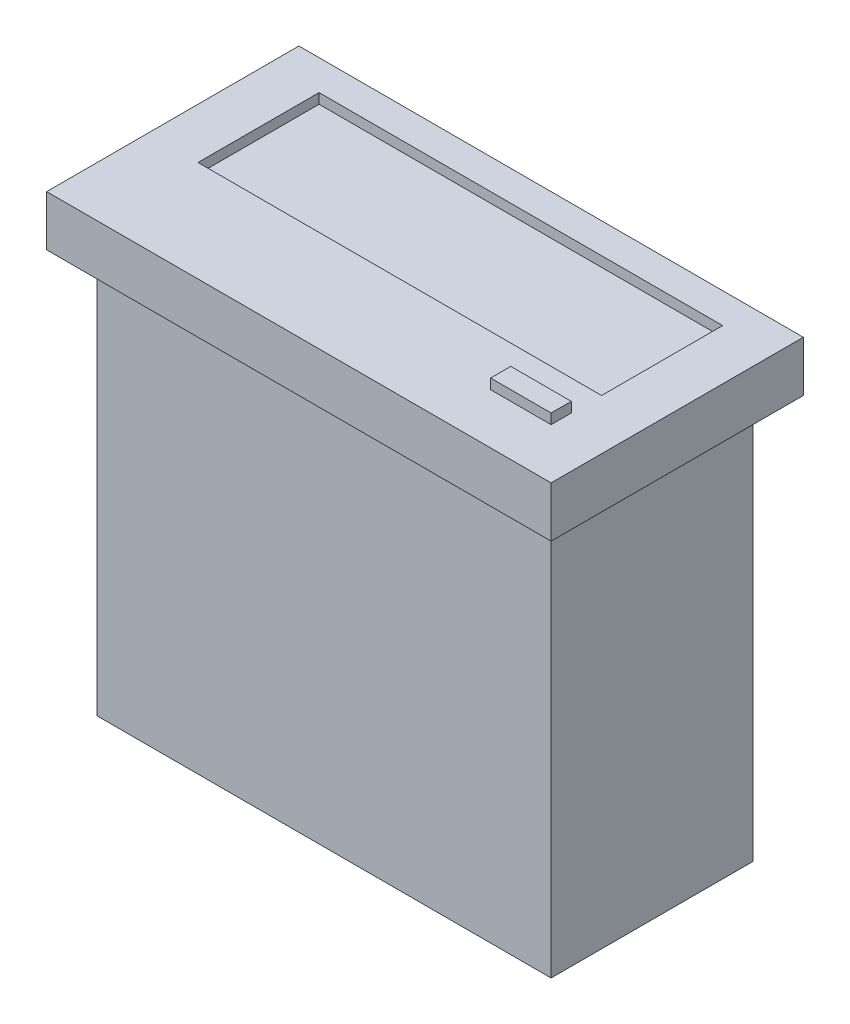
ISO-10303-21;
HEADER;
FILE_DESCRIPTION(('STEP AP214'),'2;1');
FILE_NAME('part.step','',(''),(''),'','','');
FILE_SCHEMA(('AUTOMOTIVE_DESIGN { 1 0 10303 214 1 1 1 1 }'));
ENDSEC;
DATA;
#1=APPLICATION_CONTEXT('core data for automotive mechanical design processes');
#2=APPLICATION_PROTOCOL_DEFINITION('international standard','automotive_design',2000,#1);
#3=PRODUCT_CONTEXT('',#1,'mechanical');
#4=PRODUCT('Part','Part','',(#3));
#5=PRODUCT_RELATED_PRODUCT_CATEGORY('part','',(#4));
#6=PRODUCT_DEFINITION_FORMATION('','',#4);
#7=PRODUCT_DEFINITION_CONTEXT('part definition',#1,'design');
#8=PRODUCT_DEFINITION('design','',#6,#7);
#9=PRODUCT_DEFINITION_SHAPE('','',#8);
#10=(LENGTH_UNIT() NAMED_UNIT(*) SI_UNIT(.MILLI.,.METRE.));
#11=(NAMED_UNIT(*) PLANE_ANGLE_UNIT() SI_UNIT($,.RADIAN.));
#12=(NAMED_UNIT(*) SI_UNIT($,.STERADIAN.) SOLID_ANGLE_UNIT());
#13=UNCERTAINTY_MEASURE_WITH_UNIT(LENGTH_MEASURE(1.E-05),#10,'distance_accuracy_value','');
#14=(GEOMETRIC_REPRESENTATION_CONTEXT(3) GLOBAL_UNCERTAINTY_ASSIGNED_CONTEXT((#13)) GLOBAL_UNIT_ASSIGNED_CONTEXT((#10,
#11,#12)) REPRESENTATION_CONTEXT('',''));
#15=CARTESIAN_POINT('',(0.,0.,0.));
#16=DIRECTION('',(0.,0.,1.));
#17=DIRECTION('',(1.,0.,0.));
#18=AXIS2_PLACEMENT_3D('',#15,#16,#17);
#19=CARTESIAN_POINT('',(0.,0.,0.));
#20=DIRECTION('',(0.,-1.,0.));
#21=DIRECTION('',(0.,0.,-1.));
#22=AXIS2_PLACEMENT_3D('',#19,#20,#21);
#23=PLANE('',#22);
#24=DIRECTION('',(0.,0.,1.));
#25=VECTOR('',#24,1.);
#26=CARTESIAN_POINT('',(0.,0.,0.));
#27=LINE('',#26,#25);
#28=CARTESIAN_POINT('',(0.,0.,-25.));
#29=VERTEX_POINT('',#28);
#30=CARTESIAN_POINT('',(0.,0.,0.));
#31=VERTEX_POINT('',#30);
#32=EDGE_CURVE('E277',#29,#31,#27,.T.);
#33=ORIENTED_EDGE('',*,*,#32,.T.);
#34=DIRECTION('',(1.,0.,0.));
#35=VECTOR('',#34,1.);
#36=CARTESIAN_POINT('',(0.,0.,0.));
#37=LINE('',#36,#35);
#38=CARTESIAN_POINT('',(50.,0.,0.));
#39=VERTEX_POINT('',#38);
#40=EDGE_CURVE('E298',#31,#39,#37,.T.);
#41=ORIENTED_EDGE('',*,*,#40,.T.);
#42=DIRECTION('',(0.,0.,-1.));
#43=VECTOR('',#42,1.);
#44=CARTESIAN_POINT('',(50.,0.,0.));
#45=LINE('',#44,#43);
#46=CARTESIAN_POINT('',(50.,0.,-25.));
#47=VERTEX_POINT('',#46);
#48=EDGE_CURVE('E302',#39,#47,#45,.T.);
#49=ORIENTED_EDGE('',*,*,#48,.T.);
#50=DIRECTION('',(-1.,0.,0.));
#51=VECTOR('',#50,1.);
#52=CARTESIAN_POINT('',(0.,0.,-25.));
#53=LINE('',#52,#51);
#54=EDGE_CURVE('E283',#47,#29,#53,.T.);
#55=ORIENTED_EDGE('',*,*,#54,.T.);
#56=EDGE_LOOP('',(#33,#41,#49,#55));
#57=FACE_BOUND('',#56,.T.);
#58=DIRECTION('',(1.,0.,0.));
#59=VECTOR('',#58,1.);
#60=CARTESIAN_POINT('',(5.,0.,-10.));
#61=LINE('',#60,#59);
#62=CARTESIAN_POINT('',(5.,0.,-10.));
#63=VERTEX_POINT('',#62);
#64=CARTESIAN_POINT('',(45.,0.,-10.));
#65=VERTEX_POINT('',#64);
#66=EDGE_CURVE('E186',#63,#65,#61,.T.);
#67=ORIENTED_EDGE('',*,*,#66,.F.);
#68=DIRECTION('',(0.,0.,1.));
#69=VECTOR('',#68,1.);
#70=CARTESIAN_POINT('',(5.,0.,-10.));
#71=LINE('',#70,#69);
#72=CARTESIAN_POINT('',(5.,0.,-22.));
#73=VERTEX_POINT('',#72);
#74=EDGE_CURVE('E180',#73,#63,#71,.T.);
#75=ORIENTED_EDGE('',*,*,#74,.F.);
#76=DIRECTION('',(-1.,0.,0.));
#77=VECTOR('',#76,1.);
#78=CARTESIAN_POINT('',(5.,0.,-22.));
#79=LINE('',#78,#77);
#80=CARTESIAN_POINT('',(45.,0.,-22.));
#81=VERTEX_POINT('',#80);
#82=EDGE_CURVE('E197',#81,#73,#79,.T.);
#83=ORIENTED_EDGE('',*,*,#82,.F.);
#84=DIRECTION('',(0.,0.,-1.));
#85=VECTOR('',#84,1.);
#86=CARTESIAN_POINT('',(45.,0.,-10.));
#87=LINE('',#86,#85);
#88=EDGE_CURVE('E213',#65,#81,#87,.T.);
#89=ORIENTED_EDGE('',*,*,#88,.F.);
#90=EDGE_LOOP('',(#67,#75,#83,#89));
#91=FACE_BOUND('',#90,.T.);
#92=DIRECTION('',(0.,0.,1.));
#93=VECTOR('',#92,1.);
#94=CARTESIAN_POINT('',(39.,0.,-7.));
#95=LINE('',#94,#93);
#96=CARTESIAN_POINT('',(39.,0.,-7.));
#97=VERTEX_POINT('',#96);
#98=CARTESIAN_POINT('',(39.,0.,-5.));
#99=VERTEX_POINT('',#98);
#100=EDGE_CURVE('E178',#97,#99,#95,.T.);
#101=ORIENTED_EDGE('',*,*,#100,.F.);
#102=DIRECTION('',(-1.,0.,0.));
#103=VECTOR('',#102,1.);
#104=CARTESIAN_POINT('',(39.,0.,-7.));
#105=LINE('',#104,#103);
#106=CARTESIAN_POINT('',(45.,0.,-7.));
#107=VERTEX_POINT('',#106);
#108=EDGE_CURVE('E175',#107,#97,#105,.T.);
#109=ORIENTED_EDGE('',*,*,#108,.F.);
#110=DIRECTION('',(0.,0.,-1.));
#111=VECTOR('',#110,1.);
#112=CARTESIAN_POINT('',(45.,0.,-7.));
#113=LINE('',#112,#111);
#114=CARTESIAN_POINT('',(45.,0.,-5.));
#115=VERTEX_POINT('',#114);
#116=EDGE_CURVE('E64',#115,#107,#113,.T.);
#117=ORIENTED_EDGE('',*,*,#116,.F.);
#118=DIRECTION('',(1.,0.,0.));
#119=VECTOR('',#118,1.);
#120=CARTESIAN_POINT('',(39.,0.,-5.));
#121=LINE('',#120,#119);
#122=EDGE_CURVE('E59',#99,#115,#121,.T.);
#123=ORIENTED_EDGE('',*,*,#122,.F.);
#124=EDGE_LOOP('',(#101,#109,#117,#123));
#125=FACE_BOUND('',#124,.T.);
#126=ADVANCED_FACE('F41',(#57,#91,#125),#23,.F.);
#127=CARTESIAN_POINT('',(0.,-5.,0.));
#128=DIRECTION('',(-1.,0.,0.));
#129=DIRECTION('',(0.,0.,1.));
#130=AXIS2_PLACEMENT_3D('',#127,#128,#129);
#131=PLANE('',#130);
#132=ORIENTED_EDGE('',*,*,#32,.F.);
#133=DIRECTION('',(0.,1.,0.));
#134=VECTOR('',#133,1.);
#135=CARTESIAN_POINT('',(0.,-5.,-25.));
#136=LINE('',#135,#134);
#137=CARTESIAN_POINT('',(0.,-5.,-25.));
#138=VERTEX_POINT('',#137);
#139=EDGE_CURVE('E11',#138,#29,#136,.T.);
#140=ORIENTED_EDGE('',*,*,#139,.F.);
#141=DIRECTION('',(0.,0.,1.));
#142=VECTOR('',#141,1.);
#143=CARTESIAN_POINT('',(0.,-5.,0.));
#144=LINE('',#143,#142);
#145=CARTESIAN_POINT('',(0.,-5.,0.));
#146=VERTEX_POINT('',#145);
#147=EDGE_CURVE('E278',#138,#146,#144,.T.);
#148=ORIENTED_EDGE('',*,*,#147,.T.);
#149=DIRECTION('',(0.,1.,0.));
#150=VECTOR('',#149,1.);
#151=CARTESIAN_POINT('',(0.,-5.,0.));
#152=LINE('',#151,#150);
#153=EDGE_CURVE('E45',#146,#31,#152,.T.);
#154=ORIENTED_EDGE('',*,*,#153,.T.);
#155=EDGE_LOOP('',(#132,#140,#148,#154));
#156=FACE_BOUND('',#155,.T.);
#157=ADVANCED_FACE('F43',(#156),#131,.T.);
#158=CARTESIAN_POINT('',(0.,-5.,-25.));
#159=DIRECTION('',(0.,0.,-1.));
#160=DIRECTION('',(-1.,0.,0.));
#161=AXIS2_PLACEMENT_3D('',#158,#159,#160);
#162=PLANE('',#161);
#163=ORIENTED_EDGE('',*,*,#54,.F.);
#164=DIRECTION('',(0.,1.,0.));
#165=VECTOR('',#164,1.);
#166=CARTESIAN_POINT('',(50.,-5.,-25.));
#167=LINE('',#166,#165);
#168=CARTESIAN_POINT('',(50.,-5.,-25.));
#169=VERTEX_POINT('',#168);
#170=EDGE_CURVE('E51',#169,#47,#167,.T.);
#171=ORIENTED_EDGE('',*,*,#170,.F.);
#172=DIRECTION('',(-1.,0.,0.));
#173=VECTOR('',#172,1.);
#174=CARTESIAN_POINT('',(0.,-5.,-25.));
#175=LINE('',#174,#173);
#176=EDGE_CURVE('E291',#169,#138,#175,.T.);
#177=ORIENTED_EDGE('',*,*,#176,.T.);
#178=ORIENTED_EDGE('',*,*,#139,.T.);
#179=EDGE_LOOP('',(#163,#171,#177,#178));
#180=FACE_BOUND('',#179,.T.);
#181=ADVANCED_FACE('F329',(#180),#162,.T.);
#182=CARTESIAN_POINT('',(50.,-5.,0.));
#183=DIRECTION('',(1.,0.,0.));
#184=DIRECTION('',(0.,0.,-1.));
#185=AXIS2_PLACEMENT_3D('',#182,#183,#184);
#186=PLANE('',#185);
#187=ORIENTED_EDGE('',*,*,#48,.F.);
#188=DIRECTION('',(0.,1.,0.));
#189=VECTOR('',#188,1.);
#190=CARTESIAN_POINT('',(50.,-5.,0.));
#191=LINE('',#190,#189);
#192=CARTESIAN_POINT('',(50.,-5.,0.));
#193=VERTEX_POINT('',#192);
#194=EDGE_CURVE('E310',#193,#39,#191,.T.);
#195=ORIENTED_EDGE('',*,*,#194,.F.);
#196=DIRECTION('',(0.,0.,-1.));
#197=VECTOR('',#196,1.);
#198=CARTESIAN_POINT('',(50.,-5.,0.));
#199=LINE('',#198,#197);
#200=EDGE_CURVE('E287',#193,#169,#199,.T.);
#201=ORIENTED_EDGE('',*,*,#200,.T.);
#202=ORIENTED_EDGE('',*,*,#170,.T.);
#203=EDGE_LOOP('',(#187,#195,#201,#202));
#204=FACE_BOUND('',#203,.T.);
#205=ADVANCED_FACE('F335',(#204),#186,.T.);
#206=CARTESIAN_POINT('',(0.,-5.,0.));
#207=DIRECTION('',(0.,0.,1.));
#208=DIRECTION('',(1.,0.,0.));
#209=AXIS2_PLACEMENT_3D('',#206,#207,#208);
#210=PLANE('',#209);
#211=ORIENTED_EDGE('',*,*,#40,.F.);
#212=ORIENTED_EDGE('',*,*,#153,.F.);
#213=DIRECTION('',(1.,0.,0.));
#214=VECTOR('',#213,1.);
#215=CARTESIAN_POINT('',(0.,-5.,0.));
#216=LINE('',#215,#214);
#217=EDGE_CURVE('E282',#146,#193,#216,.T.);
#218=ORIENTED_EDGE('',*,*,#217,.T.);
#219=ORIENTED_EDGE('',*,*,#194,.T.);
#220=EDGE_LOOP('',(#211,#212,#218,#219));
#221=FACE_BOUND('',#220,.T.);
#222=ADVANCED_FACE('F324',(#221),#210,.T.);
#223=CARTESIAN_POINT('',(0.,-5.,0.));
#224=DIRECTION('',(0.,-1.,0.));
#225=DIRECTION('',(0.,0.,-1.));
#226=AXIS2_PLACEMENT_3D('',#223,#224,#225);
#227=PLANE('',#226);
#228=DIRECTION('',(0.,0.,-1.));
#229=VECTOR('',#228,1.);
#230=CARTESIAN_POINT('',(2.5,-5.,-2.5));
#231=LINE('',#230,#229);
#232=CARTESIAN_POINT('',(2.5,-5.,-2.5));
#233=VERTEX_POINT('',#232);
#234=CARTESIAN_POINT('',(2.49999999999999,-5.,-22.5));
#235=VERTEX_POINT('',#234);
#236=EDGE_CURVE('E223',#233,#235,#231,.T.);
#237=ORIENTED_EDGE('',*,*,#236,.F.);
#238=DIRECTION('',(-1.,0.,0.));
#239=VECTOR('',#238,1.);
#240=CARTESIAN_POINT('',(2.5,-5.,-2.5));
#241=LINE('',#240,#239);
#242=CARTESIAN_POINT('',(47.5,-5.,-2.49999999999999));
#243=VERTEX_POINT('',#242);
#244=EDGE_CURVE('E238',#243,#233,#241,.T.);
#245=ORIENTED_EDGE('',*,*,#244,.F.);
#246=DIRECTION('',(0.,0.,1.));
#247=VECTOR('',#246,1.);
#248=CARTESIAN_POINT('',(47.5,-5.,-2.49999999999999));
#249=LINE('',#248,#247);
#250=CARTESIAN_POINT('',(47.5,-5.,-22.5));
#251=VERTEX_POINT('',#250);
#252=EDGE_CURVE('E255',#251,#243,#249,.T.);
#253=ORIENTED_EDGE('',*,*,#252,.F.);
#254=DIRECTION('',(1.,0.,0.));
#255=VECTOR('',#254,1.);
#256=CARTESIAN_POINT('',(2.49999999999999,-5.,-22.5));
#257=LINE('',#256,#255);
#258=EDGE_CURVE('E251',#235,#251,#257,.T.);
#259=ORIENTED_EDGE('',*,*,#258,.F.);
#260=EDGE_LOOP('',(#237,#245,#253,#259));
#261=FACE_BOUND('',#260,.T.);
#262=ORIENTED_EDGE('',*,*,#147,.F.);
#263=ORIENTED_EDGE('',*,*,#176,.F.);
#264=ORIENTED_EDGE('',*,*,#200,.F.);
#265=ORIENTED_EDGE('',*,*,#217,.F.);
#266=EDGE_LOOP('',(#262,#263,#264,#265));
#267=FACE_BOUND('',#266,.T.);
#268=ADVANCED_FACE('F332',(#261,#267),#227,.T.);
#269=CARTESIAN_POINT('',(2.5,-45.,-2.5));
#270=DIRECTION('',(1.,0.,0.));
#271=DIRECTION('',(0.,0.,-1.));
#272=AXIS2_PLACEMENT_3D('',#269,#270,#271);
#273=PLANE('',#272);
#274=ORIENTED_EDGE('',*,*,#236,.T.);
#275=DIRECTION('',(0.,1.,0.));
#276=VECTOR('',#275,1.);
#277=CARTESIAN_POINT('',(2.49999999999999,-45.,-22.5));
#278=LINE('',#277,#276);
#279=CARTESIAN_POINT('',(2.49999999999999,-45.,-22.5));
#280=VERTEX_POINT('',#279);
#281=EDGE_CURVE('E273',#280,#235,#278,.T.);
#282=ORIENTED_EDGE('',*,*,#281,.F.);
#283=DIRECTION('',(0.,0.,-1.));
#284=VECTOR('',#283,1.);
#285=CARTESIAN_POINT('',(2.5,-45.,-2.5));
#286=LINE('',#285,#284);
#287=CARTESIAN_POINT('',(2.5,-45.,-2.5));
#288=VERTEX_POINT('',#287);
#289=EDGE_CURVE('E233',#288,#280,#286,.T.);
#290=ORIENTED_EDGE('',*,*,#289,.F.);
#291=DIRECTION('',(0.,1.,0.));
#292=VECTOR('',#291,1.);
#293=CARTESIAN_POINT('',(2.5,-45.,-2.5));
#294=LINE('',#293,#292);
#295=EDGE_CURVE('E247',#288,#233,#294,.T.);
#296=ORIENTED_EDGE('',*,*,#295,.T.);
#297=EDGE_LOOP('',(#274,#282,#290,#296));
#298=FACE_BOUND('',#297,.T.);
#299=ADVANCED_FACE('F351',(#298),#273,.F.);
#300=CARTESIAN_POINT('',(2.49999999999999,-45.,-22.5));
#301=DIRECTION('',(0.,0.,1.));
#302=DIRECTION('',(1.,0.,0.));
#303=AXIS2_PLACEMENT_3D('',#300,#301,#302);
#304=PLANE('',#303);
#305=ORIENTED_EDGE('',*,*,#258,.T.);
#306=DIRECTION('',(0.,1.,0.));
#307=VECTOR('',#306,1.);
#308=CARTESIAN_POINT('',(47.5,-45.,-22.5));
#309=LINE('',#308,#307);
#310=CARTESIAN_POINT('',(47.5,-45.,-22.5));
#311=VERTEX_POINT('',#310);
#312=EDGE_CURVE('E269',#311,#251,#309,.T.);
#313=ORIENTED_EDGE('',*,*,#312,.F.);
#314=DIRECTION('',(1.,0.,0.));
#315=VECTOR('',#314,1.);
#316=CARTESIAN_POINT('',(2.49999999999999,-45.,-22.5));
#317=LINE('',#316,#315);
#318=EDGE_CURVE('E237',#280,#311,#317,.T.);
#319=ORIENTED_EDGE('',*,*,#318,.F.);
#320=ORIENTED_EDGE('',*,*,#281,.T.);
#321=EDGE_LOOP('',(#305,#313,#319,#320));
#322=FACE_BOUND('',#321,.T.);
#323=ADVANCED_FACE('F355',(#322),#304,.F.);
#324=CARTESIAN_POINT('',(47.5,-45.,-2.49999999999999));
#325=DIRECTION('',(-1.,0.,0.));
#326=DIRECTION('',(0.,0.,1.));
#327=AXIS2_PLACEMENT_3D('',#324,#325,#326);
#328=PLANE('',#327);
#329=ORIENTED_EDGE('',*,*,#252,.T.);
#330=DIRECTION('',(0.,1.,0.));
#331=VECTOR('',#330,1.);
#332=CARTESIAN_POINT('',(47.5,-45.,-2.49999999999999));
#333=LINE('',#332,#331);
#334=CARTESIAN_POINT('',(47.5,-45.,-2.49999999999999));
#335=VERTEX_POINT('',#334);
#336=EDGE_CURVE('E265',#335,#243,#333,.T.);
#337=ORIENTED_EDGE('',*,*,#336,.F.);
#338=DIRECTION('',(0.,0.,1.));
#339=VECTOR('',#338,1.);
#340=CARTESIAN_POINT('',(47.5,-45.,-2.49999999999999));
#341=LINE('',#340,#339);
#342=EDGE_CURVE('E241',#311,#335,#341,.T.);
#343=ORIENTED_EDGE('',*,*,#342,.F.);
#344=ORIENTED_EDGE('',*,*,#312,.T.);
#345=EDGE_LOOP('',(#329,#337,#343,#344));
#346=FACE_BOUND('',#345,.T.);
#347=ADVANCED_FACE('F359',(#346),#328,.F.);
#348=CARTESIAN_POINT('',(2.5,-45.,-2.5));
#349=DIRECTION('',(0.,0.,-1.));
#350=DIRECTION('',(-1.,0.,0.));
#351=AXIS2_PLACEMENT_3D('',#348,#349,#350);
#352=PLANE('',#351);
#353=ORIENTED_EDGE('',*,*,#244,.T.);
#354=ORIENTED_EDGE('',*,*,#295,.F.);
#355=DIRECTION('',(-1.,0.,0.));
#356=VECTOR('',#355,1.);
#357=CARTESIAN_POINT('',(2.5,-45.,-2.5));
#358=LINE('',#357,#356);
#359=EDGE_CURVE('E244',#335,#288,#358,.T.);
#360=ORIENTED_EDGE('',*,*,#359,.F.);
#361=ORIENTED_EDGE('',*,*,#336,.T.);
#362=EDGE_LOOP('',(#353,#354,#360,#361));
#363=FACE_BOUND('',#362,.T.);
#364=ADVANCED_FACE('F363',(#363),#352,.F.);
#365=CARTESIAN_POINT('',(0.,-45.,0.));
#366=DIRECTION('',(0.,-1.,0.));
#367=DIRECTION('',(0.,0.,-1.));
#368=AXIS2_PLACEMENT_3D('',#365,#366,#367);
#369=PLANE('',#368);
#370=ORIENTED_EDGE('',*,*,#289,.T.);
#371=ORIENTED_EDGE('',*,*,#318,.T.);
#372=ORIENTED_EDGE('',*,*,#342,.T.);
#373=ORIENTED_EDGE('',*,*,#359,.T.);
#374=EDGE_LOOP('',(#370,#371,#372,#373));
#375=FACE_BOUND('',#374,.T.);
#376=ADVANCED_FACE('F367',(#375),#369,.T.);
#377=CARTESIAN_POINT('',(5.,-1.,-10.));
#378=DIRECTION('',(-1.,0.,0.));
#379=DIRECTION('',(0.,0.,1.));
#380=AXIS2_PLACEMENT_3D('',#377,#378,#379);
#381=PLANE('',#380);
#382=ORIENTED_EDGE('',*,*,#74,.T.);
#383=DIRECTION('',(0.,1.,0.));
#384=VECTOR('',#383,1.);
#385=CARTESIAN_POINT('',(5.,-1.,-10.));
#386=LINE('',#385,#384);
#387=CARTESIAN_POINT('',(5.,-1.,-10.));
#388=VERTEX_POINT('',#387);
#389=EDGE_CURVE('E208',#388,#63,#386,.T.);
#390=ORIENTED_EDGE('',*,*,#389,.F.);
#391=DIRECTION('',(0.,0.,1.));
#392=VECTOR('',#391,1.);
#393=CARTESIAN_POINT('',(5.,-1.,-10.));
#394=LINE('',#393,#392);
#395=CARTESIAN_POINT('',(5.,-1.,-22.));
#396=VERTEX_POINT('',#395);
#397=EDGE_CURVE('E192',#396,#388,#394,.T.);
#398=ORIENTED_EDGE('',*,*,#397,.F.);
#399=DIRECTION('',(0.,1.,0.));
#400=VECTOR('',#399,1.);
#401=CARTESIAN_POINT('',(5.,-1.,-22.));
#402=LINE('',#401,#400);
#403=EDGE_CURVE('E220',#396,#73,#402,.T.);
#404=ORIENTED_EDGE('',*,*,#403,.T.);
#405=EDGE_LOOP('',(#382,#390,#398,#404));
#406=FACE_BOUND('',#405,.T.);
#407=ADVANCED_FACE('F371',(#406),#381,.F.);
#408=CARTESIAN_POINT('',(5.,-1.,-22.));
#409=DIRECTION('',(0.,0.,-1.));
#410=DIRECTION('',(-1.,0.,0.));
#411=AXIS2_PLACEMENT_3D('',#408,#409,#410);
#412=PLANE('',#411);
#413=ORIENTED_EDGE('',*,*,#82,.T.);
#414=ORIENTED_EDGE('',*,*,#403,.F.);
#415=DIRECTION('',(-1.,0.,0.));
#416=VECTOR('',#415,1.);
#417=CARTESIAN_POINT('',(5.,-1.,-22.));
#418=LINE('',#417,#416);
#419=CARTESIAN_POINT('',(45.,-1.,-22.));
#420=VERTEX_POINT('',#419);
#421=EDGE_CURVE('E205',#420,#396,#418,.T.);
#422=ORIENTED_EDGE('',*,*,#421,.F.);
#423=DIRECTION('',(0.,1.,0.));
#424=VECTOR('',#423,1.);
#425=CARTESIAN_POINT('',(45.,-1.,-22.));
#426=LINE('',#425,#424);
#427=EDGE_CURVE('E224',#420,#81,#426,.T.);
#428=ORIENTED_EDGE('',*,*,#427,.T.);
#429=EDGE_LOOP('',(#413,#414,#422,#428));
#430=FACE_BOUND('',#429,.T.);
#431=ADVANCED_FACE('F375',(#430),#412,.F.);
#432=CARTESIAN_POINT('',(45.,-1.,-10.));
#433=DIRECTION('',(1.,0.,0.));
#434=DIRECTION('',(0.,0.,-1.));
#435=AXIS2_PLACEMENT_3D('',#432,#433,#434);
#436=PLANE('',#435);
#437=ORIENTED_EDGE('',*,*,#88,.T.);
#438=ORIENTED_EDGE('',*,*,#427,.F.);
#439=DIRECTION('',(0.,0.,-1.));
#440=VECTOR('',#439,1.);
#441=CARTESIAN_POINT('',(45.,-1.,-10.));
#442=LINE('',#441,#440);
#443=CARTESIAN_POINT('',(45.,-1.,-10.));
#444=VERTEX_POINT('',#443);
#445=EDGE_CURVE('E201',#444,#420,#442,.T.);
#446=ORIENTED_EDGE('',*,*,#445,.F.);
#447=DIRECTION('',(0.,1.,0.));
#448=VECTOR('',#447,1.);
#449=CARTESIAN_POINT('',(45.,-1.,-10.));
#450=LINE('',#449,#448);
#451=EDGE_CURVE('E227',#444,#65,#450,.T.);
#452=ORIENTED_EDGE('',*,*,#451,.T.);
#453=EDGE_LOOP('',(#437,#438,#446,#452));
#454=FACE_BOUND('',#453,.T.);
#455=ADVANCED_FACE('F381',(#454),#436,.F.);
#456=CARTESIAN_POINT('',(5.,-1.,-10.));
#457=DIRECTION('',(0.,0.,1.));
#458=DIRECTION('',(1.,0.,0.));
#459=AXIS2_PLACEMENT_3D('',#456,#457,#458);
#460=PLANE('',#459);
#461=ORIENTED_EDGE('',*,*,#66,.T.);
#462=ORIENTED_EDGE('',*,*,#451,.F.);
#463=DIRECTION('',(1.,0.,0.));
#464=VECTOR('',#463,1.);
#465=CARTESIAN_POINT('',(5.,-1.,-10.));
#466=LINE('',#465,#464);
#467=EDGE_CURVE('E196',#388,#444,#466,.T.);
#468=ORIENTED_EDGE('',*,*,#467,.F.);
#469=ORIENTED_EDGE('',*,*,#389,.T.);
#470=EDGE_LOOP('',(#461,#462,#468,#469));
#471=FACE_BOUND('',#470,.T.);
#472=ADVANCED_FACE('F377',(#471),#460,.F.);
#473=CARTESIAN_POINT('',(0.,-1.,0.));
#474=DIRECTION('',(0.,-1.,0.));
#475=DIRECTION('',(0.,0.,-1.));
#476=AXIS2_PLACEMENT_3D('',#473,#474,#475);
#477=PLANE('',#476);
#478=ORIENTED_EDGE('',*,*,#397,.T.);
#479=ORIENTED_EDGE('',*,*,#467,.T.);
#480=ORIENTED_EDGE('',*,*,#445,.T.);
#481=ORIENTED_EDGE('',*,*,#421,.T.);
#482=EDGE_LOOP('',(#478,#479,#480,#481));
#483=FACE_BOUND('',#482,.T.);
#484=ADVANCED_FACE('F380',(#483),#477,.F.);
#485=CARTESIAN_POINT('',(39.,1.,-7.));
#486=DIRECTION('',(1.,0.,0.));
#487=DIRECTION('',(0.,0.,-1.));
#488=AXIS2_PLACEMENT_3D('',#485,#486,#487);
#489=PLANE('',#488);
#490=ORIENTED_EDGE('',*,*,#100,.T.);
#491=DIRECTION('',(0.,-1.,0.));
#492=VECTOR('',#491,1.);
#493=CARTESIAN_POINT('',(39.,1.,-5.));
#494=LINE('',#493,#492);
#495=CARTESIAN_POINT('',(39.,1.,-5.));
#496=VERTEX_POINT('',#495);
#497=EDGE_CURVE('E157',#496,#99,#494,.T.);
#498=ORIENTED_EDGE('',*,*,#497,.F.);
#499=DIRECTION('',(0.,0.,1.));
#500=VECTOR('',#499,1.);
#501=CARTESIAN_POINT('',(39.,1.,-7.));
#502=LINE('',#501,#500);
#503=CARTESIAN_POINT('',(39.,1.,-7.));
#504=VERTEX_POINT('',#503);
#505=EDGE_CURVE('E165',#504,#496,#502,.T.);
#506=ORIENTED_EDGE('',*,*,#505,.F.);
#507=DIRECTION('',(0.,-1.,0.));
#508=VECTOR('',#507,1.);
#509=CARTESIAN_POINT('',(39.,1.,-7.));
#510=LINE('',#509,#508);
#511=EDGE_CURVE('E592',#504,#97,#510,.T.);
#512=ORIENTED_EDGE('',*,*,#511,.T.);
#513=EDGE_LOOP('',(#490,#498,#506,#512));
#514=FACE_BOUND('',#513,.T.);
#515=ADVANCED_FACE('F177',(#514),#489,.F.);
#516=CARTESIAN_POINT('',(39.,1.,-5.));
#517=DIRECTION('',(0.,0.,-1.));
#518=DIRECTION('',(-1.,0.,0.));
#519=AXIS2_PLACEMENT_3D('',#516,#517,#518);
#520=PLANE('',#519);
#521=ORIENTED_EDGE('',*,*,#122,.T.);
#522=DIRECTION('',(0.,-1.,0.));
#523=VECTOR('',#522,1.);
#524=CARTESIAN_POINT('',(45.,1.,-5.));
#525=LINE('',#524,#523);
#526=CARTESIAN_POINT('',(45.,1.,-5.));
#527=VERTEX_POINT('',#526);
#528=EDGE_CURVE('E160',#527,#115,#525,.T.);
#529=ORIENTED_EDGE('',*,*,#528,.F.);
#530=DIRECTION('',(1.,0.,0.));
#531=VECTOR('',#530,1.);
#532=CARTESIAN_POINT('',(39.,1.,-5.));
#533=LINE('',#532,#531);
#534=EDGE_CURVE('E153',#496,#527,#533,.T.);
#535=ORIENTED_EDGE('',*,*,#534,.F.);
#536=ORIENTED_EDGE('',*,*,#497,.T.);
#537=EDGE_LOOP('',(#521,#529,#535,#536));
#538=FACE_BOUND('',#537,.T.);
#539=ADVANCED_FACE('F155',(#538),#520,.F.);
#540=CARTESIAN_POINT('',(45.,1.,-7.));
#541=DIRECTION('',(-1.,0.,0.));
#542=DIRECTION('',(0.,0.,1.));
#543=AXIS2_PLACEMENT_3D('',#540,#541,#542);
#544=PLANE('',#543);
#545=ORIENTED_EDGE('',*,*,#116,.T.);
#546=DIRECTION('',(0.,-1.,0.));
#547=VECTOR('',#546,1.);
#548=CARTESIAN_POINT('',(45.,1.,-7.));
#549=LINE('',#548,#547);
#550=CARTESIAN_POINT('',(45.,1.,-7.));
#551=VERTEX_POINT('',#550);
#552=EDGE_CURVE('E188',#551,#107,#549,.T.);
#553=ORIENTED_EDGE('',*,*,#552,.F.);
#554=DIRECTION('',(0.,0.,-1.));
#555=VECTOR('',#554,1.);
#556=CARTESIAN_POINT('',(45.,1.,-7.));
#557=LINE('',#556,#555);
#558=EDGE_CURVE('E164',#527,#551,#557,.T.);
#559=ORIENTED_EDGE('',*,*,#558,.F.);
#560=ORIENTED_EDGE('',*,*,#528,.T.);
#561=EDGE_LOOP('',(#545,#553,#559,#560));
#562=FACE_BOUND('',#561,.T.);
#563=ADVANCED_FACE('F396',(#562),#544,.F.);
#564=CARTESIAN_POINT('',(39.,1.,-7.));
#565=DIRECTION('',(0.,0.,1.));
#566=DIRECTION('',(1.,0.,0.));
#567=AXIS2_PLACEMENT_3D('',#564,#565,#566);
#568=PLANE('',#567);
#569=ORIENTED_EDGE('',*,*,#108,.T.);
#570=ORIENTED_EDGE('',*,*,#511,.F.);
#571=DIRECTION('',(-1.,0.,0.));
#572=VECTOR('',#571,1.);
#573=CARTESIAN_POINT('',(39.,1.,-7.));
#574=LINE('',#573,#572);
#575=EDGE_CURVE('E170',#551,#504,#574,.T.);
#576=ORIENTED_EDGE('',*,*,#575,.F.);
#577=ORIENTED_EDGE('',*,*,#552,.T.);
#578=EDGE_LOOP('',(#569,#570,#576,#577));
#579=FACE_BOUND('',#578,.T.);
#580=ADVANCED_FACE('F399',(#579),#568,.F.);
#581=CARTESIAN_POINT('',(0.,1.,0.));
#582=DIRECTION('',(0.,1.,0.));
#583=DIRECTION('',(0.,0.,1.));
#584=AXIS2_PLACEMENT_3D('',#581,#582,#583);
#585=PLANE('',#584);
#586=ORIENTED_EDGE('',*,*,#505,.T.);
#587=ORIENTED_EDGE('',*,*,#534,.T.);
#588=ORIENTED_EDGE('',*,*,#558,.T.);
#589=ORIENTED_EDGE('',*,*,#575,.T.);
#590=EDGE_LOOP('',(#586,#587,#588,#589));
#591=FACE_BOUND('',#590,.T.);
#592=ADVANCED_FACE('F168',(#591),#585,.T.);
#593=CLOSED_SHELL('',(#126,#157,#181,#205,#222,#268,#299,#323,#347,#364,#376,#407,#431,#455,
#472,#484,#515,#539,#563,#580,#592));
#594=MANIFOLD_SOLID_BREP('B2',#593);
#595=ADVANCED_BREP_SHAPE_REPRESENTATION('',(#18,#594),#14);
#596=SHAPE_DEFINITION_REPRESENTATION(#9,#595);
ENDSEC;
END-ISO-10303-21;
